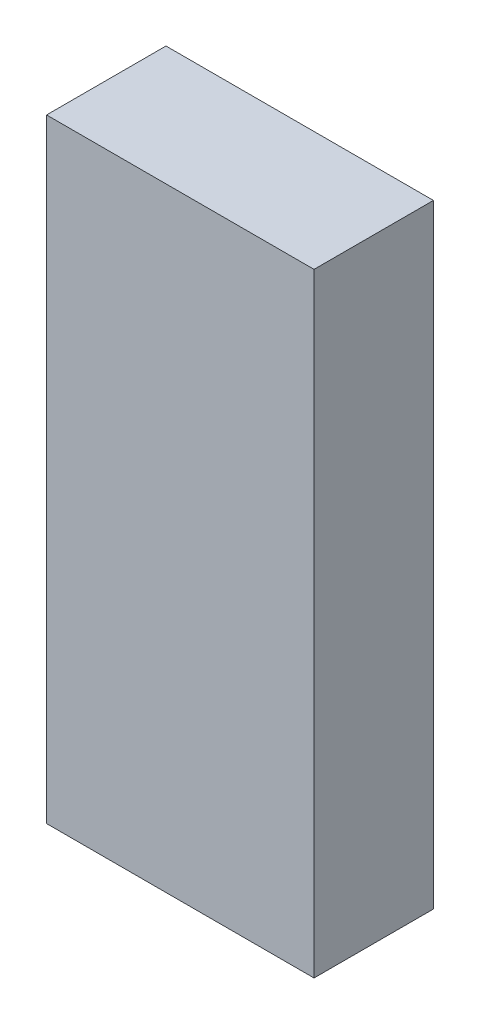
ISO-10303-21;
HEADER;
FILE_DESCRIPTION(('STEP AP214'),'2;1');
FILE_NAME('part.step','',(''),(''),'','','');
FILE_SCHEMA(('AUTOMOTIVE_DESIGN { 1 0 10303 214 1 1 1 1 }'));
ENDSEC;
DATA;
#1=APPLICATION_CONTEXT('core data for automotive mechanical design processes');
#2=APPLICATION_PROTOCOL_DEFINITION('international standard','automotive_design',2000,#1);
#3=PRODUCT_CONTEXT('',#1,'mechanical');
#4=PRODUCT('Part','Part','',(#3));
#5=PRODUCT_RELATED_PRODUCT_CATEGORY('part','',(#4));
#6=PRODUCT_DEFINITION_FORMATION('','',#4);
#7=PRODUCT_DEFINITION_CONTEXT('part definition',#1,'design');
#8=PRODUCT_DEFINITION('design','',#6,#7);
#9=PRODUCT_DEFINITION_SHAPE('','',#8);
#10=(LENGTH_UNIT() NAMED_UNIT(*) SI_UNIT(.MILLI.,.METRE.));
#11=(NAMED_UNIT(*) PLANE_ANGLE_UNIT() SI_UNIT($,.RADIAN.));
#12=(NAMED_UNIT(*) SI_UNIT($,.STERADIAN.) SOLID_ANGLE_UNIT());
#13=UNCERTAINTY_MEASURE_WITH_UNIT(LENGTH_MEASURE(1.E-05),#10,'distance_accuracy_value','');
#14=(GEOMETRIC_REPRESENTATION_CONTEXT(3) GLOBAL_UNCERTAINTY_ASSIGNED_CONTEXT((#13)) GLOBAL_UNIT_ASSIGNED_CONTEXT((#10,
#11,#12)) REPRESENTATION_CONTEXT('',''));
#15=CARTESIAN_POINT('',(0.,0.,0.));
#16=DIRECTION('',(0.,0.,1.));
#17=DIRECTION('',(1.,0.,0.));
#18=AXIS2_PLACEMENT_3D('',#15,#16,#17);
#19=CARTESIAN_POINT('',(-28.,128.5,12.5));
#20=DIRECTION('',(1.,0.,0.));
#21=DIRECTION('',(0.,0.,-1.));
#22=AXIS2_PLACEMENT_3D('',#19,#20,#21);
#23=PLANE('',#22);
#24=DIRECTION('',(0.,0.,1.));
#25=VECTOR('',#24,1.);
#26=CARTESIAN_POINT('',(-28.,0.,12.5));
#27=LINE('',#26,#25);
#28=CARTESIAN_POINT('',(-28.,0.,-12.5));
#29=VERTEX_POINT('',#28);
#30=CARTESIAN_POINT('',(-28.,0.,12.5));
#31=VERTEX_POINT('',#30);
#32=EDGE_CURVE('E111',#29,#31,#27,.T.);
#33=ORIENTED_EDGE('',*,*,#32,.T.);
#34=DIRECTION('',(0.,-1.,0.));
#35=VECTOR('',#34,1.);
#36=CARTESIAN_POINT('',(-28.,128.5,12.5));
#37=LINE('',#36,#35);
#38=CARTESIAN_POINT('',(-28.,128.5,12.5));
#39=VERTEX_POINT('',#38);
#40=EDGE_CURVE('E11',#39,#31,#37,.T.);
#41=ORIENTED_EDGE('',*,*,#40,.F.);
#42=DIRECTION('',(0.,0.,1.));
#43=VECTOR('',#42,1.);
#44=CARTESIAN_POINT('',(-28.,128.5,12.5));
#45=LINE('',#44,#43);
#46=CARTESIAN_POINT('',(-28.,128.5,-12.5));
#47=VERTEX_POINT('',#46);
#48=EDGE_CURVE('E95',#47,#39,#45,.T.);
#49=ORIENTED_EDGE('',*,*,#48,.F.);
#50=DIRECTION('',(0.,-1.,0.));
#51=VECTOR('',#50,1.);
#52=CARTESIAN_POINT('',(-28.,128.5,-12.5));
#53=LINE('',#52,#51);
#54=EDGE_CURVE('E107',#47,#29,#53,.T.);
#55=ORIENTED_EDGE('',*,*,#54,.T.);
#56=EDGE_LOOP('',(#33,#41,#49,#55));
#57=FACE_BOUND('',#56,.T.);
#58=ADVANCED_FACE('F43',(#57),#23,.F.);
#59=CARTESIAN_POINT('',(28.,128.5,12.5));
#60=DIRECTION('',(0.,0.,-1.));
#61=DIRECTION('',(-1.,0.,0.));
#62=AXIS2_PLACEMENT_3D('',#59,#60,#61);
#63=PLANE('',#62);
#64=DIRECTION('',(1.,0.,0.));
#65=VECTOR('',#64,1.);
#66=CARTESIAN_POINT('',(28.,0.,12.5));
#67=LINE('',#66,#65);
#68=CARTESIAN_POINT('',(28.,0.,12.5));
#69=VERTEX_POINT('',#68);
#70=EDGE_CURVE('E100',#31,#69,#67,.T.);
#71=ORIENTED_EDGE('',*,*,#70,.T.);
#72=DIRECTION('',(0.,-1.,0.));
#73=VECTOR('',#72,1.);
#74=CARTESIAN_POINT('',(28.,128.5,12.5));
#75=LINE('',#74,#73);
#76=CARTESIAN_POINT('',(28.,128.5,12.5));
#77=VERTEX_POINT('',#76);
#78=EDGE_CURVE('E52',#77,#69,#75,.T.);
#79=ORIENTED_EDGE('',*,*,#78,.F.);
#80=DIRECTION('',(1.,0.,0.));
#81=VECTOR('',#80,1.);
#82=CARTESIAN_POINT('',(28.,128.5,12.5));
#83=LINE('',#82,#81);
#84=EDGE_CURVE('E90',#39,#77,#83,.T.);
#85=ORIENTED_EDGE('',*,*,#84,.F.);
#86=ORIENTED_EDGE('',*,*,#40,.T.);
#87=EDGE_LOOP('',(#71,#79,#85,#86));
#88=FACE_BOUND('',#87,.T.);
#89=ADVANCED_FACE('F99',(#88),#63,.F.);
#90=CARTESIAN_POINT('',(28.,128.5,12.5));
#91=DIRECTION('',(-1.,0.,0.));
#92=DIRECTION('',(0.,0.,1.));
#93=AXIS2_PLACEMENT_3D('',#90,#91,#92);
#94=PLANE('',#93);
#95=DIRECTION('',(0.,0.,-1.));
#96=VECTOR('',#95,1.);
#97=CARTESIAN_POINT('',(28.,0.,12.5));
#98=LINE('',#97,#96);
#99=CARTESIAN_POINT('',(28.,0.,-12.5));
#100=VERTEX_POINT('',#99);
#101=EDGE_CURVE('E77',#69,#100,#98,.T.);
#102=ORIENTED_EDGE('',*,*,#101,.T.);
#103=DIRECTION('',(0.,-1.,0.));
#104=VECTOR('',#103,1.);
#105=CARTESIAN_POINT('',(28.,128.5,-12.5));
#106=LINE('',#105,#104);
#107=CARTESIAN_POINT('',(28.,128.5,-12.5));
#108=VERTEX_POINT('',#107);
#109=EDGE_CURVE('E102',#108,#100,#106,.T.);
#110=ORIENTED_EDGE('',*,*,#109,.F.);
#111=DIRECTION('',(0.,0.,-1.));
#112=VECTOR('',#111,1.);
#113=CARTESIAN_POINT('',(28.,128.5,12.5));
#114=LINE('',#113,#112);
#115=EDGE_CURVE('E93',#77,#108,#114,.T.);
#116=ORIENTED_EDGE('',*,*,#115,.F.);
#117=ORIENTED_EDGE('',*,*,#78,.T.);
#118=EDGE_LOOP('',(#102,#110,#116,#117));
#119=FACE_BOUND('',#118,.T.);
#120=ADVANCED_FACE('F103',(#119),#94,.F.);
#121=CARTESIAN_POINT('',(28.,128.5,-12.5));
#122=DIRECTION('',(0.,0.,1.));
#123=DIRECTION('',(1.,0.,0.));
#124=AXIS2_PLACEMENT_3D('',#121,#122,#123);
#125=PLANE('',#124);
#126=DIRECTION('',(-1.,0.,0.));
#127=VECTOR('',#126,1.);
#128=CARTESIAN_POINT('',(28.,0.,-12.5));
#129=LINE('',#128,#127);
#130=EDGE_CURVE('E83',#100,#29,#129,.T.);
#131=ORIENTED_EDGE('',*,*,#130,.T.);
#132=ORIENTED_EDGE('',*,*,#54,.F.);
#133=DIRECTION('',(-1.,0.,0.));
#134=VECTOR('',#133,1.);
#135=CARTESIAN_POINT('',(28.,128.5,-12.5));
#136=LINE('',#135,#134);
#137=EDGE_CURVE('E60',#108,#47,#136,.T.);
#138=ORIENTED_EDGE('',*,*,#137,.F.);
#139=ORIENTED_EDGE('',*,*,#109,.T.);
#140=EDGE_LOOP('',(#131,#132,#138,#139));
#141=FACE_BOUND('',#140,.T.);
#142=ADVANCED_FACE('F124',(#141),#125,.F.);
#143=CARTESIAN_POINT('',(0.,128.5,0.));
#144=DIRECTION('',(0.,1.,0.));
#145=DIRECTION('',(0.,0.,1.));
#146=AXIS2_PLACEMENT_3D('',#143,#144,#145);
#147=PLANE('',#146);
#148=ORIENTED_EDGE('',*,*,#48,.T.);
#149=ORIENTED_EDGE('',*,*,#84,.T.);
#150=ORIENTED_EDGE('',*,*,#115,.T.);
#151=ORIENTED_EDGE('',*,*,#137,.T.);
#152=EDGE_LOOP('',(#148,#149,#150,#151));
#153=FACE_BOUND('',#152,.T.);
#154=ADVANCED_FACE('F91',(#153),#147,.T.);
#155=CARTESIAN_POINT('',(0.,0.,0.));
#156=DIRECTION('',(0.,1.,0.));
#157=DIRECTION('',(0.,0.,1.));
#158=AXIS2_PLACEMENT_3D('',#155,#156,#157);
#159=PLANE('',#158);
#160=ORIENTED_EDGE('',*,*,#32,.F.);
#161=ORIENTED_EDGE('',*,*,#130,.F.);
#162=ORIENTED_EDGE('',*,*,#101,.F.);
#163=ORIENTED_EDGE('',*,*,#70,.F.);
#164=EDGE_LOOP('',(#160,#161,#162,#163));
#165=FACE_BOUND('',#164,.T.);
#166=ADVANCED_FACE('F127',(#165),#159,.F.);
#167=CLOSED_SHELL('',(#58,#89,#120,#142,#154,#166));
#168=MANIFOLD_SOLID_BREP('B2',#167);
#169=ADVANCED_BREP_SHAPE_REPRESENTATION('',(#18,#168),#14);
#170=SHAPE_DEFINITION_REPRESENTATION(#9,#169);
ENDSEC;
END-ISO-10303-21;
